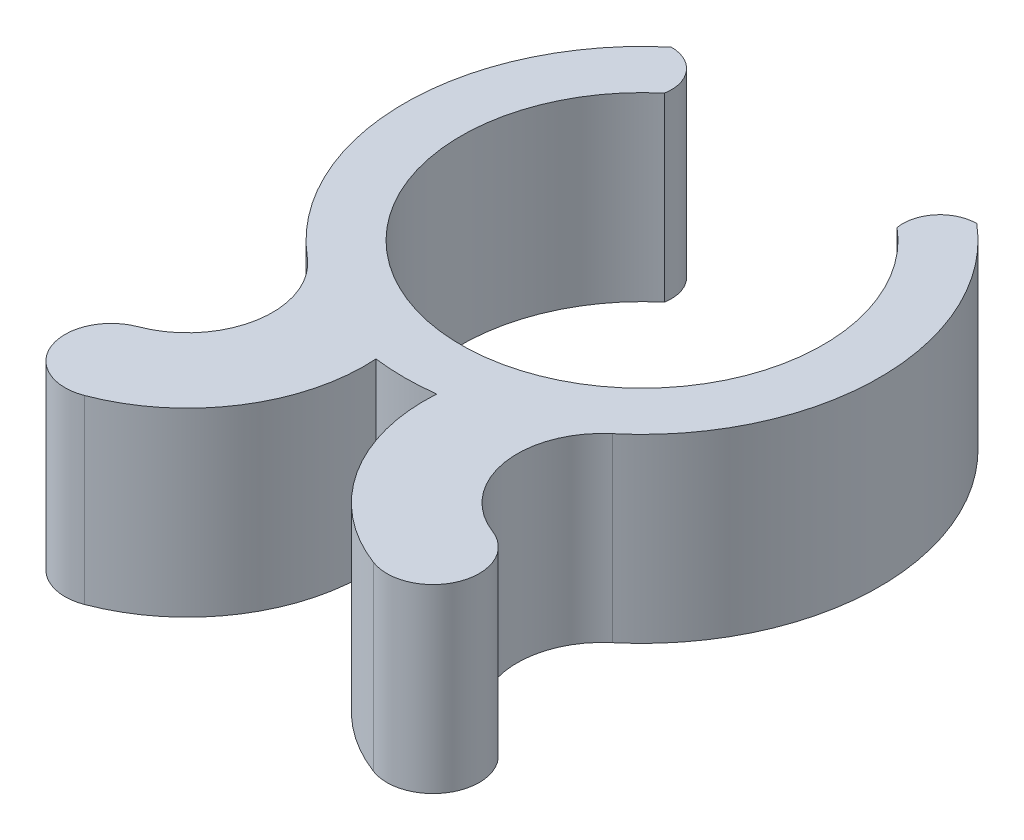
ISO-10303-21;
HEADER;
FILE_DESCRIPTION(('STEP AP214'),'2;1');
FILE_NAME('part.step','',(''),(''),'','','');
FILE_SCHEMA(('AUTOMOTIVE_DESIGN { 1 0 10303 214 1 1 1 1 }'));
ENDSEC;
DATA;
#1=APPLICATION_CONTEXT('core data for automotive mechanical design processes');
#2=APPLICATION_PROTOCOL_DEFINITION('international standard','automotive_design',2000,#1);
#3=PRODUCT_CONTEXT('',#1,'mechanical');
#4=PRODUCT('Part','Part','',(#3));
#5=PRODUCT_RELATED_PRODUCT_CATEGORY('part','',(#4));
#6=PRODUCT_DEFINITION_FORMATION('','',#4);
#7=PRODUCT_DEFINITION_CONTEXT('part definition',#1,'design');
#8=PRODUCT_DEFINITION('design','',#6,#7);
#9=PRODUCT_DEFINITION_SHAPE('','',#8);
#10=(LENGTH_UNIT() NAMED_UNIT(*) SI_UNIT(.MILLI.,.METRE.));
#11=(NAMED_UNIT(*) PLANE_ANGLE_UNIT() SI_UNIT($,.RADIAN.));
#12=(NAMED_UNIT(*) SI_UNIT($,.STERADIAN.) SOLID_ANGLE_UNIT());
#13=UNCERTAINTY_MEASURE_WITH_UNIT(LENGTH_MEASURE(1.E-05),#10,'distance_accuracy_value','');
#14=(GEOMETRIC_REPRESENTATION_CONTEXT(3) GLOBAL_UNCERTAINTY_ASSIGNED_CONTEXT((#13)) GLOBAL_UNIT_ASSIGNED_CONTEXT((#10,
#11,#12)) REPRESENTATION_CONTEXT('',''));
#15=CARTESIAN_POINT('',(0.,0.,0.));
#16=DIRECTION('',(0.,0.,1.));
#17=DIRECTION('',(1.,0.,0.));
#18=AXIS2_PLACEMENT_3D('',#15,#16,#17);
#19=CARTESIAN_POINT('',(0.,8.,0.));
#20=DIRECTION('',(0.,-1.,0.));
#21=DIRECTION('',(0.,0.,-1.));
#22=AXIS2_PLACEMENT_3D('',#19,#20,#21);
#23=CYLINDRICAL_SURFACE('',#22,10.5);
#24=CARTESIAN_POINT('',(0.,0.,0.));
#25=DIRECTION('',(0.,1.,0.));
#26=DIRECTION('',(0.,0.,1.));
#27=AXIS2_PLACEMENT_3D('',#24,#25,#26);
#28=CIRCLE('',#27,10.5);
#29=CARTESIAN_POINT('',(1.34195519288543,0.,10.4138924644096));
#30=VERTEX_POINT('',#29);
#31=CARTESIAN_POINT('',(-1.34195519288543,0.,10.4138924644096));
#32=VERTEX_POINT('',#31);
#33=EDGE_CURVE('E149',#30,#32,#28,.F.);
#34=ORIENTED_EDGE('',*,*,#33,.F.);
#35=DIRECTION('',(0.,-1.,0.));
#36=VECTOR('',#35,1.);
#37=CARTESIAN_POINT('',(1.34195519288543,8.,10.4138924644096));
#38=LINE('',#37,#36);
#39=CARTESIAN_POINT('',(1.34195519288543,8.,10.4138924644096));
#40=VERTEX_POINT('',#39);
#41=EDGE_CURVE('E202',#40,#30,#38,.T.);
#42=ORIENTED_EDGE('',*,*,#41,.F.);
#43=CARTESIAN_POINT('',(0.,8.,0.));
#44=DIRECTION('',(0.,1.,0.));
#45=DIRECTION('',(0.,0.,1.));
#46=AXIS2_PLACEMENT_3D('',#43,#44,#45);
#47=CIRCLE('',#46,10.5);
#48=CARTESIAN_POINT('',(-1.34195519288543,8.,10.4138924644096));
#49=VERTEX_POINT('',#48);
#50=EDGE_CURVE('E97',#40,#49,#47,.F.);
#51=ORIENTED_EDGE('',*,*,#50,.T.);
#52=DIRECTION('',(0.,-1.,0.));
#53=VECTOR('',#52,1.);
#54=CARTESIAN_POINT('',(-1.34195519288543,8.,10.4138924644096));
#55=LINE('',#54,#53);
#56=EDGE_CURVE('E11',#49,#32,#55,.T.);
#57=ORIENTED_EDGE('',*,*,#56,.T.);
#58=EDGE_LOOP('',(#34,#42,#51,#57));
#59=FACE_BOUND('',#58,.T.);
#60=ADVANCED_FACE('F35',(#59),#23,.T.);
#61=CARTESIAN_POINT('',(6.74926990170864,8.,-8.04346665274929));
#62=VERTEX_POINT('',#61);
#63=CARTESIAN_POINT('',(6.74926990170865,8.,8.04346665274928));
#64=VERTEX_POINT('',#63);
#65=EDGE_CURVE('E194',#62,#64,#47,.F.);
#66=ORIENTED_EDGE('',*,*,#65,.T.);
#67=DIRECTION('',(0.,-1.,0.));
#68=VECTOR('',#67,1.);
#69=CARTESIAN_POINT('',(6.74926990170865,8.,8.04346665274928));
#70=LINE('',#69,#68);
#71=CARTESIAN_POINT('',(6.74926990170865,0.,8.04346665274928));
#72=VERTEX_POINT('',#71);
#73=EDGE_CURVE('E192',#64,#72,#70,.T.);
#74=ORIENTED_EDGE('',*,*,#73,.T.);
#75=CARTESIAN_POINT('',(6.74926990170864,0.,-8.04346665274929));
#76=VERTEX_POINT('',#75);
#77=EDGE_CURVE('E151',#76,#72,#28,.F.);
#78=ORIENTED_EDGE('',*,*,#77,.F.);
#79=DIRECTION('',(0.,-1.,0.));
#80=VECTOR('',#79,1.);
#81=CARTESIAN_POINT('',(6.74926990170864,8.,-8.04346665274929));
#82=LINE('',#81,#80);
#83=EDGE_CURVE('E43',#62,#76,#82,.T.);
#84=ORIENTED_EDGE('',*,*,#83,.F.);
#85=EDGE_LOOP('',(#66,#74,#78,#84));
#86=FACE_BOUND('',#85,.T.);
#87=ADVANCED_FACE('F190',(#86),#23,.T.);
#88=CARTESIAN_POINT('',(-9.16552687838354,8.,10.9230495853324));
#89=DIRECTION('',(0.,-1.,0.));
#90=DIRECTION('',(0.,0.,-1.));
#91=AXIS2_PLACEMENT_3D('',#88,#89,#90);
#92=CYLINDRICAL_SURFACE('',#91,7.84012212225767);
#93=CARTESIAN_POINT('',(-9.16552687838354,0.,10.9230495853324));
#94=DIRECTION('',(0.,1.,0.));
#95=DIRECTION('',(0.,0.,1.));
#96=AXIS2_PLACEMENT_3D('',#93,#94,#95);
#97=CIRCLE('',#96,7.84012212225767);
#98=CARTESIAN_POINT('',(-6.38957185510112,0.,18.2552790280481));
#99=VERTEX_POINT('',#98);
#100=EDGE_CURVE('E147',#32,#99,#97,.F.);
#101=ORIENTED_EDGE('',*,*,#100,.F.);
#102=ORIENTED_EDGE('',*,*,#56,.F.);
#103=CARTESIAN_POINT('',(-9.16552687838354,8.,10.9230495853324));
#104=DIRECTION('',(0.,1.,0.));
#105=DIRECTION('',(0.,0.,1.));
#106=AXIS2_PLACEMENT_3D('',#103,#104,#105);
#107=CIRCLE('',#106,7.84012212225767);
#108=CARTESIAN_POINT('',(-6.38957185510112,8.,18.2552790280481));
#109=VERTEX_POINT('',#108);
#110=EDGE_CURVE('E168',#49,#109,#107,.F.);
#111=ORIENTED_EDGE('',*,*,#110,.T.);
#112=DIRECTION('',(0.,-1.,0.));
#113=VECTOR('',#112,1.);
#114=CARTESIAN_POINT('',(-6.38957185510112,8.,18.2552790280481));
#115=LINE('',#114,#113);
#116=EDGE_CURVE('E59',#109,#99,#115,.T.);
#117=ORIENTED_EDGE('',*,*,#116,.T.);
#118=EDGE_LOOP('',(#101,#102,#111,#117));
#119=FACE_BOUND('',#118,.T.);
#120=ADVANCED_FACE('F37',(#119),#92,.T.);
#121=CARTESIAN_POINT('',(6.74926990170864,8.,-6.41170754108394));
#122=DIRECTION('',(0.,-1.,0.));
#123=DIRECTION('',(0.,0.,-1.));
#124=AXIS2_PLACEMENT_3D('',#121,#122,#123);
#125=CYLINDRICAL_SURFACE('',#124,1.63175911166534);
#126=CARTESIAN_POINT('',(6.74926990170864,0.,-6.41170754108394));
#127=DIRECTION('',(0.,1.,0.));
#128=DIRECTION('',(0.,0.,1.));
#129=AXIS2_PLACEMENT_3D('',#126,#127,#128);
#130=CIRCLE('',#129,1.63175911166534);
#131=CARTESIAN_POINT('',(5.1423008774923,0.,-6.12835554495184));
#132=VERTEX_POINT('',#131);
#133=EDGE_CURVE('E154',#76,#132,#130,.T.);
#134=ORIENTED_EDGE('',*,*,#133,.T.);
#135=DIRECTION('',(0.,-1.,0.));
#136=VECTOR('',#135,1.);
#137=CARTESIAN_POINT('',(5.1423008774923,8.,-6.12835554495184));
#138=LINE('',#137,#136);
#139=CARTESIAN_POINT('',(5.1423008774923,8.,-6.12835554495184));
#140=VERTEX_POINT('',#139);
#141=EDGE_CURVE('E174',#140,#132,#138,.T.);
#142=ORIENTED_EDGE('',*,*,#141,.F.);
#143=CARTESIAN_POINT('',(6.74926990170864,8.,-6.41170754108394));
#144=DIRECTION('',(0.,1.,0.));
#145=DIRECTION('',(0.,0.,1.));
#146=AXIS2_PLACEMENT_3D('',#143,#144,#145);
#147=CIRCLE('',#146,1.63175911166534);
#148=EDGE_CURVE('E181',#62,#140,#147,.T.);
#149=ORIENTED_EDGE('',*,*,#148,.F.);
#150=ORIENTED_EDGE('',*,*,#83,.T.);
#151=EDGE_LOOP('',(#134,#142,#149,#150));
#152=FACE_BOUND('',#151,.T.);
#153=ADVANCED_FACE('F179',(#152),#125,.T.);
#154=CARTESIAN_POINT('',(0.,8.,0.));
#155=DIRECTION('',(0.,-1.,0.));
#156=DIRECTION('',(0.,0.,-1.));
#157=AXIS2_PLACEMENT_3D('',#154,#155,#156);
#158=CYLINDRICAL_SURFACE('',#157,8.);
#159=CARTESIAN_POINT('',(0.,0.,0.));
#160=DIRECTION('',(0.,1.,0.));
#161=DIRECTION('',(0.,0.,1.));
#162=AXIS2_PLACEMENT_3D('',#159,#160,#161);
#163=CIRCLE('',#162,8.);
#164=CARTESIAN_POINT('',(-5.1423008774923,0.,-6.12835554495184));
#165=VERTEX_POINT('',#164);
#166=EDGE_CURVE('E156',#132,#165,#163,.F.);
#167=ORIENTED_EDGE('',*,*,#166,.T.);
#168=DIRECTION('',(0.,-1.,0.));
#169=VECTOR('',#168,1.);
#170=CARTESIAN_POINT('',(-5.1423008774923,8.,-6.12835554495184));
#171=LINE('',#170,#169);
#172=CARTESIAN_POINT('',(-5.1423008774923,8.,-6.12835554495184));
#173=VERTEX_POINT('',#172);
#174=EDGE_CURVE('E172',#173,#165,#171,.T.);
#175=ORIENTED_EDGE('',*,*,#174,.F.);
#176=CARTESIAN_POINT('',(0.,8.,0.));
#177=DIRECTION('',(0.,1.,0.));
#178=DIRECTION('',(0.,0.,1.));
#179=AXIS2_PLACEMENT_3D('',#176,#177,#178);
#180=CIRCLE('',#179,8.);
#181=EDGE_CURVE('E142',#140,#173,#180,.F.);
#182=ORIENTED_EDGE('',*,*,#181,.F.);
#183=ORIENTED_EDGE('',*,*,#141,.T.);
#184=EDGE_LOOP('',(#167,#175,#182,#183));
#185=FACE_BOUND('',#184,.T.);
#186=ADVANCED_FACE('F217',(#185),#158,.F.);
#187=CARTESIAN_POINT('',(-6.74926990170864,8.,-6.41170754108394));
#188=DIRECTION('',(0.,-1.,0.));
#189=DIRECTION('',(0.,0.,-1.));
#190=AXIS2_PLACEMENT_3D('',#187,#188,#189);
#191=CYLINDRICAL_SURFACE('',#190,1.63175911166534);
#192=CARTESIAN_POINT('',(-6.74926990170864,0.,-6.41170754108394));
#193=DIRECTION('',(0.,1.,0.));
#194=DIRECTION('',(0.,0.,1.));
#195=AXIS2_PLACEMENT_3D('',#192,#193,#194);
#196=CIRCLE('',#195,1.63175911166534);
#197=CARTESIAN_POINT('',(-6.74926990170864,0.,-8.04346665274929));
#198=VERTEX_POINT('',#197);
#199=EDGE_CURVE('E159',#198,#165,#196,.F.);
#200=ORIENTED_EDGE('',*,*,#199,.F.);
#201=DIRECTION('',(0.,-1.,0.));
#202=VECTOR('',#201,1.);
#203=CARTESIAN_POINT('',(-6.74926990170864,8.,-8.04346665274929));
#204=LINE('',#203,#202);
#205=CARTESIAN_POINT('',(-6.74926990170864,8.,-8.04346665274929));
#206=VERTEX_POINT('',#205);
#207=EDGE_CURVE('E127',#206,#198,#204,.T.);
#208=ORIENTED_EDGE('',*,*,#207,.F.);
#209=CARTESIAN_POINT('',(-6.74926990170864,8.,-6.41170754108394));
#210=DIRECTION('',(0.,1.,0.));
#211=DIRECTION('',(0.,0.,1.));
#212=AXIS2_PLACEMENT_3D('',#209,#210,#211);
#213=CIRCLE('',#212,1.63175911166534);
#214=EDGE_CURVE('E140',#206,#173,#213,.F.);
#215=ORIENTED_EDGE('',*,*,#214,.T.);
#216=ORIENTED_EDGE('',*,*,#174,.T.);
#217=EDGE_LOOP('',(#200,#208,#215,#216));
#218=FACE_BOUND('',#217,.T.);
#219=ADVANCED_FACE('F220',(#218),#191,.T.);
#220=CARTESIAN_POINT('',(0.,8.,0.));
#221=DIRECTION('',(0.,-1.,0.));
#222=DIRECTION('',(0.,0.,-1.));
#223=AXIS2_PLACEMENT_3D('',#220,#221,#222);
#224=CYLINDRICAL_SURFACE('',#223,10.5);
#225=CARTESIAN_POINT('',(0.,0.,0.));
#226=DIRECTION('',(0.,1.,0.));
#227=DIRECTION('',(0.,0.,1.));
#228=AXIS2_PLACEMENT_3D('',#225,#226,#227);
#229=CIRCLE('',#228,10.5);
#230=CARTESIAN_POINT('',(-6.74926990170865,0.,8.04346665274928));
#231=VERTEX_POINT('',#230);
#232=EDGE_CURVE('E123',#231,#198,#229,.F.);
#233=ORIENTED_EDGE('',*,*,#232,.F.);
#234=DIRECTION('',(0.,-1.,0.));
#235=VECTOR('',#234,1.);
#236=CARTESIAN_POINT('',(-6.74926990170865,8.,8.04346665274928));
#237=LINE('',#236,#235);
#238=CARTESIAN_POINT('',(-6.74926990170865,8.,8.04346665274928));
#239=VERTEX_POINT('',#238);
#240=EDGE_CURVE('E117',#239,#231,#237,.T.);
#241=ORIENTED_EDGE('',*,*,#240,.F.);
#242=CARTESIAN_POINT('',(0.,8.,0.));
#243=DIRECTION('',(0.,1.,0.));
#244=DIRECTION('',(0.,0.,1.));
#245=AXIS2_PLACEMENT_3D('',#242,#243,#244);
#246=CIRCLE('',#245,10.5);
#247=EDGE_CURVE('E121',#239,#206,#246,.F.);
#248=ORIENTED_EDGE('',*,*,#247,.T.);
#249=ORIENTED_EDGE('',*,*,#207,.T.);
#250=EDGE_LOOP('',(#233,#241,#248,#249));
#251=FACE_BOUND('',#250,.T.);
#252=ADVANCED_FACE('F119',(#251),#224,.T.);
#253=CARTESIAN_POINT('',(-9.16552687838354,8.,10.9230495853324));
#254=DIRECTION('',(0.,-1.,0.));
#255=DIRECTION('',(0.,0.,-1.));
#256=AXIS2_PLACEMENT_3D('',#253,#254,#255);
#257=CYLINDRICAL_SURFACE('',#256,3.75902855043083);
#258=CARTESIAN_POINT('',(-9.16552687838354,0.,10.9230495853324));
#259=DIRECTION('',(0.,1.,0.));
#260=DIRECTION('',(0.,0.,1.));
#261=AXIS2_PLACEMENT_3D('',#258,#259,#260);
#262=CIRCLE('',#261,3.75902855043083);
#263=CARTESIAN_POINT('',(-7.83456620908396,0.,14.4385636785671));
#264=VERTEX_POINT('',#263);
#265=EDGE_CURVE('E163',#231,#264,#262,.F.);
#266=ORIENTED_EDGE('',*,*,#265,.T.);
#267=DIRECTION('',(0.,-1.,0.));
#268=VECTOR('',#267,1.);
#269=CARTESIAN_POINT('',(-7.83456620908396,8.,14.4385636785671));
#270=LINE('',#269,#268);
#271=CARTESIAN_POINT('',(-7.83456620908396,8.,14.4385636785671));
#272=VERTEX_POINT('',#271);
#273=EDGE_CURVE('E128',#272,#264,#270,.T.);
#274=ORIENTED_EDGE('',*,*,#273,.F.);
#275=CARTESIAN_POINT('',(-9.16552687838354,8.,10.9230495853324));
#276=DIRECTION('',(0.,1.,0.));
#277=DIRECTION('',(0.,0.,1.));
#278=AXIS2_PLACEMENT_3D('',#275,#276,#277);
#279=CIRCLE('',#278,3.75902855043083);
#280=EDGE_CURVE('E131',#239,#272,#279,.F.);
#281=ORIENTED_EDGE('',*,*,#280,.F.);
#282=ORIENTED_EDGE('',*,*,#240,.T.);
#283=EDGE_LOOP('',(#266,#274,#281,#282));
#284=FACE_BOUND('',#283,.T.);
#285=ADVANCED_FACE('F132',(#284),#257,.F.);
#286=CARTESIAN_POINT('',(-7.11206903209254,8.,16.3469213533076));
#287=DIRECTION('',(0.,-1.,0.));
#288=DIRECTION('',(0.,0.,-1.));
#289=AXIS2_PLACEMENT_3D('',#286,#287,#288);
#290=CYLINDRICAL_SURFACE('',#289,2.04054678591342);
#291=CARTESIAN_POINT('',(-7.11206903209254,0.,16.3469213533076));
#292=DIRECTION('',(0.,1.,0.));
#293=DIRECTION('',(0.,0.,1.));
#294=AXIS2_PLACEMENT_3D('',#291,#292,#293);
#295=CIRCLE('',#294,2.04054678591342);
#296=EDGE_CURVE('E165',#99,#264,#295,.F.);
#297=ORIENTED_EDGE('',*,*,#296,.F.);
#298=ORIENTED_EDGE('',*,*,#116,.F.);
#299=CARTESIAN_POINT('',(-7.11206903209254,8.,16.3469213533076));
#300=DIRECTION('',(0.,1.,0.));
#301=DIRECTION('',(0.,0.,1.));
#302=AXIS2_PLACEMENT_3D('',#299,#300,#301);
#303=CIRCLE('',#302,2.04054678591342);
#304=EDGE_CURVE('E135',#109,#272,#303,.F.);
#305=ORIENTED_EDGE('',*,*,#304,.T.);
#306=ORIENTED_EDGE('',*,*,#273,.T.);
#307=EDGE_LOOP('',(#297,#298,#305,#306));
#308=FACE_BOUND('',#307,.T.);
#309=ADVANCED_FACE('F221',(#308),#290,.T.);
#310=CARTESIAN_POINT('',(0.,8.,0.));
#311=DIRECTION('',(0.,1.,0.));
#312=DIRECTION('',(0.,0.,1.));
#313=AXIS2_PLACEMENT_3D('',#310,#311,#312);
#314=PLANE('',#313);
#315=ORIENTED_EDGE('',*,*,#247,.F.);
#316=ORIENTED_EDGE('',*,*,#280,.T.);
#317=ORIENTED_EDGE('',*,*,#304,.F.);
#318=ORIENTED_EDGE('',*,*,#110,.F.);
#319=ORIENTED_EDGE('',*,*,#50,.F.);
#320=CARTESIAN_POINT('',(9.16552687838354,8.,10.9230495853324));
#321=DIRECTION('',(0.,-1.,0.));
#322=DIRECTION('',(0.,0.,1.));
#323=AXIS2_PLACEMENT_3D('',#320,#321,#322);
#324=CIRCLE('',#323,7.84012212225767);
#325=CARTESIAN_POINT('',(6.38957185510112,8.,18.2552790280481));
#326=VERTEX_POINT('',#325);
#327=EDGE_CURVE('E231',#40,#326,#324,.F.);
#328=ORIENTED_EDGE('',*,*,#327,.T.);
#329=CARTESIAN_POINT('',(7.11206903209254,8.,16.3469213533076));
#330=DIRECTION('',(0.,-1.,0.));
#331=DIRECTION('',(0.,0.,1.));
#332=AXIS2_PLACEMENT_3D('',#329,#330,#331);
#333=CIRCLE('',#332,2.04054678591342);
#334=CARTESIAN_POINT('',(7.83456620908396,8.,14.4385636785671));
#335=VERTEX_POINT('',#334);
#336=EDGE_CURVE('E233',#326,#335,#333,.F.);
#337=ORIENTED_EDGE('',*,*,#336,.T.);
#338=CARTESIAN_POINT('',(9.16552687838354,8.,10.9230495853324));
#339=DIRECTION('',(0.,-1.,0.));
#340=DIRECTION('',(0.,0.,1.));
#341=AXIS2_PLACEMENT_3D('',#338,#339,#340);
#342=CIRCLE('',#341,3.75902855043083);
#343=EDGE_CURVE('E206',#64,#335,#342,.F.);
#344=ORIENTED_EDGE('',*,*,#343,.F.);
#345=ORIENTED_EDGE('',*,*,#65,.F.);
#346=ORIENTED_EDGE('',*,*,#148,.T.);
#347=ORIENTED_EDGE('',*,*,#181,.T.);
#348=ORIENTED_EDGE('',*,*,#214,.F.);
#349=EDGE_LOOP('',(#315,#316,#317,#318,#319,#328,#337,#344,#345,#346,#347,#348));
#350=FACE_BOUND('',#349,.T.);
#351=ADVANCED_FACE('F138',(#350),#314,.T.);
#352=CARTESIAN_POINT('',(0.,0.,0.));
#353=DIRECTION('',(0.,1.,0.));
#354=DIRECTION('',(0.,0.,1.));
#355=AXIS2_PLACEMENT_3D('',#352,#353,#354);
#356=PLANE('',#355);
#357=ORIENTED_EDGE('',*,*,#33,.T.);
#358=ORIENTED_EDGE('',*,*,#100,.T.);
#359=ORIENTED_EDGE('',*,*,#296,.T.);
#360=ORIENTED_EDGE('',*,*,#265,.F.);
#361=ORIENTED_EDGE('',*,*,#232,.T.);
#362=ORIENTED_EDGE('',*,*,#199,.T.);
#363=ORIENTED_EDGE('',*,*,#166,.F.);
#364=ORIENTED_EDGE('',*,*,#133,.F.);
#365=ORIENTED_EDGE('',*,*,#77,.T.);
#366=CARTESIAN_POINT('',(9.16552687838354,0.,10.9230495853324));
#367=DIRECTION('',(0.,-1.,0.));
#368=DIRECTION('',(0.,0.,1.));
#369=AXIS2_PLACEMENT_3D('',#366,#367,#368);
#370=CIRCLE('',#369,3.75902855043083);
#371=CARTESIAN_POINT('',(7.83456620908396,0.,14.4385636785671));
#372=VERTEX_POINT('',#371);
#373=EDGE_CURVE('E234',#72,#372,#370,.F.);
#374=ORIENTED_EDGE('',*,*,#373,.T.);
#375=CARTESIAN_POINT('',(7.11206903209254,0.,16.3469213533076));
#376=DIRECTION('',(0.,-1.,0.));
#377=DIRECTION('',(0.,0.,1.));
#378=AXIS2_PLACEMENT_3D('',#375,#376,#377);
#379=CIRCLE('',#378,2.04054678591342);
#380=CARTESIAN_POINT('',(6.38957185510112,0.,18.2552790280481));
#381=VERTEX_POINT('',#380);
#382=EDGE_CURVE('E237',#381,#372,#379,.F.);
#383=ORIENTED_EDGE('',*,*,#382,.F.);
#384=CARTESIAN_POINT('',(9.16552687838354,0.,10.9230495853324));
#385=DIRECTION('',(0.,-1.,0.));
#386=DIRECTION('',(0.,0.,1.));
#387=AXIS2_PLACEMENT_3D('',#384,#385,#386);
#388=CIRCLE('',#387,7.84012212225767);
#389=EDGE_CURVE('E50',#30,#381,#388,.F.);
#390=ORIENTED_EDGE('',*,*,#389,.F.);
#391=EDGE_LOOP('',(#357,#358,#359,#360,#361,#362,#363,#364,#365,#374,#383,#390));
#392=FACE_BOUND('',#391,.T.);
#393=ADVANCED_FACE('F187',(#392),#356,.F.);
#394=CARTESIAN_POINT('',(9.16552687838354,8.,10.9230495853324));
#395=DIRECTION('',(0.,-1.,0.));
#396=DIRECTION('',(0.,0.,-1.));
#397=AXIS2_PLACEMENT_3D('',#394,#395,#396);
#398=CYLINDRICAL_SURFACE('',#397,7.84012212225767);
#399=ORIENTED_EDGE('',*,*,#389,.T.);
#400=DIRECTION('',(0.,-1.,0.));
#401=VECTOR('',#400,1.);
#402=CARTESIAN_POINT('',(6.38957185510112,8.,18.2552790280481));
#403=LINE('',#402,#401);
#404=EDGE_CURVE('E150',#326,#381,#403,.T.);
#405=ORIENTED_EDGE('',*,*,#404,.F.);
#406=ORIENTED_EDGE('',*,*,#327,.F.);
#407=ORIENTED_EDGE('',*,*,#41,.T.);
#408=EDGE_LOOP('',(#399,#405,#406,#407));
#409=FACE_BOUND('',#408,.T.);
#410=ADVANCED_FACE('F228',(#409),#398,.T.);
#411=CARTESIAN_POINT('',(7.11206903209254,8.,16.3469213533076));
#412=DIRECTION('',(0.,-1.,0.));
#413=DIRECTION('',(0.,0.,-1.));
#414=AXIS2_PLACEMENT_3D('',#411,#412,#413);
#415=CYLINDRICAL_SURFACE('',#414,2.04054678591342);
#416=ORIENTED_EDGE('',*,*,#382,.T.);
#417=DIRECTION('',(0.,-1.,0.));
#418=VECTOR('',#417,1.);
#419=CARTESIAN_POINT('',(7.83456620908396,8.,14.4385636785671));
#420=LINE('',#419,#418);
#421=EDGE_CURVE('E201',#335,#372,#420,.T.);
#422=ORIENTED_EDGE('',*,*,#421,.F.);
#423=ORIENTED_EDGE('',*,*,#336,.F.);
#424=ORIENTED_EDGE('',*,*,#404,.T.);
#425=EDGE_LOOP('',(#416,#422,#423,#424));
#426=FACE_BOUND('',#425,.T.);
#427=ADVANCED_FACE('F244',(#426),#415,.T.);
#428=CARTESIAN_POINT('',(9.16552687838354,8.,10.9230495853324));
#429=DIRECTION('',(0.,-1.,0.));
#430=DIRECTION('',(0.,0.,-1.));
#431=AXIS2_PLACEMENT_3D('',#428,#429,#430);
#432=CYLINDRICAL_SURFACE('',#431,3.75902855043083);
#433=ORIENTED_EDGE('',*,*,#373,.F.);
#434=ORIENTED_EDGE('',*,*,#73,.F.);
#435=ORIENTED_EDGE('',*,*,#343,.T.);
#436=ORIENTED_EDGE('',*,*,#421,.T.);
#437=EDGE_LOOP('',(#433,#434,#435,#436));
#438=FACE_BOUND('',#437,.T.);
#439=ADVANCED_FACE('F247',(#438),#432,.F.);
#440=CLOSED_SHELL('',(#60,#87,#120,#153,#186,#219,#252,#285,#309,#351,#393,#410,#427,#439));
#441=MANIFOLD_SOLID_BREP('B2',#440);
#442=ADVANCED_BREP_SHAPE_REPRESENTATION('',(#18,#441),#14);
#443=SHAPE_DEFINITION_REPRESENTATION(#9,#442);
ENDSEC;
END-ISO-10303-21;
